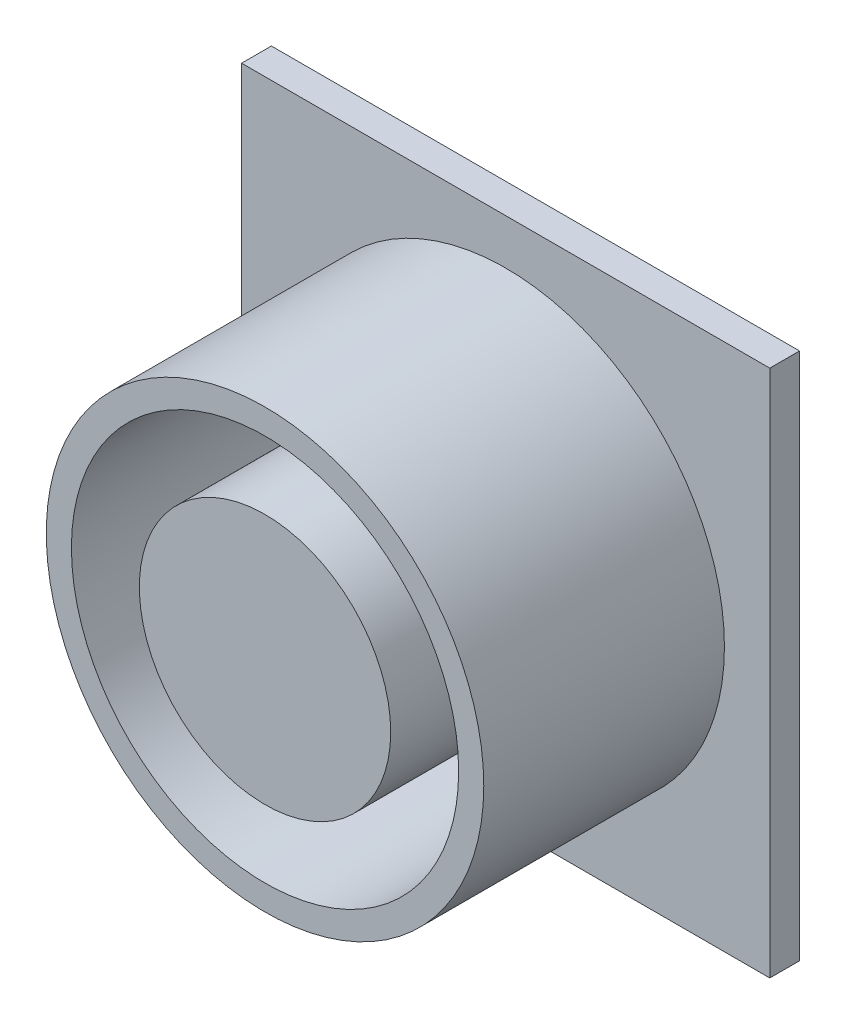
ISO-10303-21;
HEADER;
FILE_DESCRIPTION(('STEP AP214'),'2;1');
FILE_NAME('part.step','',(''),(''),'','','');
FILE_SCHEMA(('AUTOMOTIVE_DESIGN { 1 0 10303 214 1 1 1 1 }'));
ENDSEC;
DATA;
#1=APPLICATION_CONTEXT('core data for automotive mechanical design processes');
#2=APPLICATION_PROTOCOL_DEFINITION('international standard','automotive_design',2000,#1);
#3=PRODUCT_CONTEXT('',#1,'mechanical');
#4=PRODUCT('Part','Part','',(#3));
#5=PRODUCT_RELATED_PRODUCT_CATEGORY('part','',(#4));
#6=PRODUCT_DEFINITION_FORMATION('','',#4);
#7=PRODUCT_DEFINITION_CONTEXT('part definition',#1,'design');
#8=PRODUCT_DEFINITION('design','',#6,#7);
#9=PRODUCT_DEFINITION_SHAPE('','',#8);
#10=(LENGTH_UNIT() NAMED_UNIT(*) SI_UNIT(.MILLI.,.METRE.));
#11=(NAMED_UNIT(*) PLANE_ANGLE_UNIT() SI_UNIT($,.RADIAN.));
#12=(NAMED_UNIT(*) SI_UNIT($,.STERADIAN.) SOLID_ANGLE_UNIT());
#13=UNCERTAINTY_MEASURE_WITH_UNIT(LENGTH_MEASURE(1.E-05),#10,'distance_accuracy_value','');
#14=(GEOMETRIC_REPRESENTATION_CONTEXT(3) GLOBAL_UNCERTAINTY_ASSIGNED_CONTEXT((#13)) GLOBAL_UNIT_ASSIGNED_CONTEXT((#10,
#11,#12)) REPRESENTATION_CONTEXT('',''));
#15=CARTESIAN_POINT('',(0.,0.,0.));
#16=DIRECTION('',(0.,0.,1.));
#17=DIRECTION('',(1.,0.,0.));
#18=AXIS2_PLACEMENT_3D('',#15,#16,#17);
#19=CARTESIAN_POINT('',(-35.14598,-35.14598,3.9624));
#20=DIRECTION('',(0.,1.,0.));
#21=DIRECTION('',(0.,0.,1.));
#22=AXIS2_PLACEMENT_3D('',#19,#20,#21);
#23=PLANE('',#22);
#24=DIRECTION('',(1.,0.,0.));
#25=VECTOR('',#24,1.);
#26=CARTESIAN_POINT('',(-35.14598,-35.14598,0.));
#27=LINE('',#26,#25);
#28=CARTESIAN_POINT('',(-35.14598,-35.14598,0.));
#29=VERTEX_POINT('',#28);
#30=CARTESIAN_POINT('',(35.14598,-35.14598,0.));
#31=VERTEX_POINT('',#30);
#32=EDGE_CURVE('E122',#29,#31,#27,.T.);
#33=ORIENTED_EDGE('',*,*,#32,.T.);
#34=DIRECTION('',(0.,0.,-1.));
#35=VECTOR('',#34,1.);
#36=CARTESIAN_POINT('',(35.14598,-35.14598,3.9624));
#37=LINE('',#36,#35);
#38=CARTESIAN_POINT('',(35.14598,-35.14598,3.9624));
#39=VERTEX_POINT('',#38);
#40=EDGE_CURVE('E60',#39,#31,#37,.T.);
#41=ORIENTED_EDGE('',*,*,#40,.F.);
#42=DIRECTION('',(1.,0.,0.));
#43=VECTOR('',#42,1.);
#44=CARTESIAN_POINT('',(-35.14598,-35.14598,3.9624));
#45=LINE('',#44,#43);
#46=CARTESIAN_POINT('',(-35.14598,-35.14598,3.9624));
#47=VERTEX_POINT('',#46);
#48=EDGE_CURVE('E102',#47,#39,#45,.T.);
#49=ORIENTED_EDGE('',*,*,#48,.F.);
#50=DIRECTION('',(0.,0.,-1.));
#51=VECTOR('',#50,1.);
#52=CARTESIAN_POINT('',(-35.14598,-35.14598,3.9624));
#53=LINE('',#52,#51);
#54=EDGE_CURVE('E68',#47,#29,#53,.T.);
#55=ORIENTED_EDGE('',*,*,#54,.T.);
#56=EDGE_LOOP('',(#33,#41,#49,#55));
#57=FACE_BOUND('',#56,.T.);
#58=ADVANCED_FACE('F51',(#57),#23,.F.);
#59=CARTESIAN_POINT('',(35.14598,-35.14598,3.9624));
#60=DIRECTION('',(-1.,0.,0.));
#61=DIRECTION('',(0.,0.,1.));
#62=AXIS2_PLACEMENT_3D('',#59,#60,#61);
#63=PLANE('',#62);
#64=DIRECTION('',(0.,1.,0.));
#65=VECTOR('',#64,1.);
#66=CARTESIAN_POINT('',(35.14598,-35.14598,0.));
#67=LINE('',#66,#65);
#68=CARTESIAN_POINT('',(35.14598,35.14598,0.));
#69=VERTEX_POINT('',#68);
#70=EDGE_CURVE('E109',#31,#69,#67,.T.);
#71=ORIENTED_EDGE('',*,*,#70,.T.);
#72=DIRECTION('',(0.,0.,-1.));
#73=VECTOR('',#72,1.);
#74=CARTESIAN_POINT('',(35.14598,35.14598,3.9624));
#75=LINE('',#74,#73);
#76=CARTESIAN_POINT('',(35.14598,35.14598,3.9624));
#77=VERTEX_POINT('',#76);
#78=EDGE_CURVE('E107',#77,#69,#75,.T.);
#79=ORIENTED_EDGE('',*,*,#78,.F.);
#80=DIRECTION('',(0.,1.,0.));
#81=VECTOR('',#80,1.);
#82=CARTESIAN_POINT('',(35.14598,-35.14598,3.9624));
#83=LINE('',#82,#81);
#84=EDGE_CURVE('E94',#39,#77,#83,.T.);
#85=ORIENTED_EDGE('',*,*,#84,.F.);
#86=ORIENTED_EDGE('',*,*,#40,.T.);
#87=EDGE_LOOP('',(#71,#79,#85,#86));
#88=FACE_BOUND('',#87,.T.);
#89=ADVANCED_FACE('F108',(#88),#63,.F.);
#90=CARTESIAN_POINT('',(-35.14598,35.14598,3.9624));
#91=DIRECTION('',(0.,1.,0.));
#92=DIRECTION('',(0.,0.,1.));
#93=AXIS2_PLACEMENT_3D('',#90,#91,#92);
#94=PLANE('',#93);
#95=DIRECTION('',(1.,0.,0.));
#96=VECTOR('',#95,1.);
#97=CARTESIAN_POINT('',(-35.14598,35.14598,0.));
#98=LINE('',#97,#96);
#99=CARTESIAN_POINT('',(-35.14598,35.14598,0.));
#100=VERTEX_POINT('',#99);
#101=EDGE_CURVE('E128',#100,#69,#98,.T.);
#102=ORIENTED_EDGE('',*,*,#101,.F.);
#103=DIRECTION('',(0.,0.,-1.));
#104=VECTOR('',#103,1.);
#105=CARTESIAN_POINT('',(-35.14598,35.14598,3.9624));
#106=LINE('',#105,#104);
#107=CARTESIAN_POINT('',(-35.14598,35.14598,3.9624));
#108=VERTEX_POINT('',#107);
#109=EDGE_CURVE('E82',#108,#100,#106,.T.);
#110=ORIENTED_EDGE('',*,*,#109,.F.);
#111=DIRECTION('',(1.,0.,0.));
#112=VECTOR('',#111,1.);
#113=CARTESIAN_POINT('',(-35.14598,35.14598,3.9624));
#114=LINE('',#113,#112);
#115=EDGE_CURVE('E101',#108,#77,#114,.T.);
#116=ORIENTED_EDGE('',*,*,#115,.T.);
#117=ORIENTED_EDGE('',*,*,#78,.T.);
#118=EDGE_LOOP('',(#102,#110,#116,#117));
#119=FACE_BOUND('',#118,.T.);
#120=ADVANCED_FACE('F114',(#119),#94,.T.);
#121=CARTESIAN_POINT('',(-35.14598,-35.14598,3.9624));
#122=DIRECTION('',(-1.,0.,0.));
#123=DIRECTION('',(0.,0.,1.));
#124=AXIS2_PLACEMENT_3D('',#121,#122,#123);
#125=PLANE('',#124);
#126=DIRECTION('',(0.,1.,0.));
#127=VECTOR('',#126,1.);
#128=CARTESIAN_POINT('',(-35.14598,-35.14598,0.));
#129=LINE('',#128,#127);
#130=EDGE_CURVE('E131',#29,#100,#129,.T.);
#131=ORIENTED_EDGE('',*,*,#130,.F.);
#132=ORIENTED_EDGE('',*,*,#54,.F.);
#133=DIRECTION('',(0.,1.,0.));
#134=VECTOR('',#133,1.);
#135=CARTESIAN_POINT('',(-35.14598,-35.14598,3.9624));
#136=LINE('',#135,#134);
#137=EDGE_CURVE('E116',#47,#108,#136,.T.);
#138=ORIENTED_EDGE('',*,*,#137,.T.);
#139=ORIENTED_EDGE('',*,*,#109,.T.);
#140=EDGE_LOOP('',(#131,#132,#138,#139));
#141=FACE_BOUND('',#140,.T.);
#142=ADVANCED_FACE('F141',(#141),#125,.T.);
#143=CARTESIAN_POINT('',(0.,0.,3.9624));
#144=DIRECTION('',(0.,0.,1.));
#145=DIRECTION('',(1.,0.,0.));
#146=AXIS2_PLACEMENT_3D('',#143,#144,#145);
#147=PLANE('',#146);
#148=CARTESIAN_POINT('',(0.,0.,3.9624));
#149=DIRECTION('',(0.,0.,1.));
#150=DIRECTION('',(1.,0.,0.));
#151=AXIS2_PLACEMENT_3D('',#148,#149,#150);
#152=CIRCLE('',#151,29.1113264519275);
#153=CARTESIAN_POINT('',(29.1113264519275,0.,3.9624));
#154=VERTEX_POINT('',#153);
#155=EDGE_CURVE('E252',#154,#154,#152,.T.);
#156=ORIENTED_EDGE('',*,*,#155,.F.);
#157=EDGE_LOOP('',(#156));
#158=FACE_BOUND('',#157,.T.);
#159=ORIENTED_EDGE('',*,*,#48,.T.);
#160=ORIENTED_EDGE('',*,*,#84,.T.);
#161=ORIENTED_EDGE('',*,*,#115,.F.);
#162=ORIENTED_EDGE('',*,*,#137,.F.);
#163=EDGE_LOOP('',(#159,#160,#161,#162));
#164=FACE_BOUND('',#163,.T.);
#165=ADVANCED_FACE('F98',(#158,#164),#147,.T.);
#166=CARTESIAN_POINT('',(0.,0.,0.));
#167=DIRECTION('',(0.,0.,1.));
#168=DIRECTION('',(1.,0.,0.));
#169=AXIS2_PLACEMENT_3D('',#166,#167,#168);
#170=PLANE('',#169);
#171=ORIENTED_EDGE('',*,*,#32,.F.);
#172=ORIENTED_EDGE('',*,*,#130,.T.);
#173=ORIENTED_EDGE('',*,*,#101,.T.);
#174=ORIENTED_EDGE('',*,*,#70,.F.);
#175=EDGE_LOOP('',(#171,#172,#173,#174));
#176=FACE_BOUND('',#175,.T.);
#177=ADVANCED_FACE('F140',(#176),#170,.F.);
#178=CARTESIAN_POINT('',(0.,0.,35.9918));
#179=DIRECTION('',(0.,0.,1.));
#180=DIRECTION('',(1.,0.,0.));
#181=AXIS2_PLACEMENT_3D('',#178,#179,#180);
#182=PLANE('',#181);
#183=CARTESIAN_POINT('',(0.,0.,35.9918));
#184=DIRECTION('',(0.,0.,1.));
#185=DIRECTION('',(1.,0.,0.));
#186=AXIS2_PLACEMENT_3D('',#183,#184,#185);
#187=CIRCLE('',#186,29.1113264519275);
#188=CARTESIAN_POINT('',(29.1113264519275,0.,35.9918));
#189=VERTEX_POINT('',#188);
#190=EDGE_CURVE('E125',#189,#189,#187,.T.);
#191=ORIENTED_EDGE('',*,*,#190,.T.);
#192=EDGE_LOOP('',(#191));
#193=FACE_BOUND('',#192,.T.);
#194=CARTESIAN_POINT('',(0.,0.,35.9918));
#195=DIRECTION('',(0.,0.,1.));
#196=DIRECTION('',(1.,0.,0.));
#197=AXIS2_PLACEMENT_3D('',#194,#195,#196);
#198=CIRCLE('',#197,25.7683);
#199=CARTESIAN_POINT('',(25.7683,0.,35.9918));
#200=VERTEX_POINT('',#199);
#201=EDGE_CURVE('E246',#200,#200,#198,.T.);
#202=ORIENTED_EDGE('',*,*,#201,.F.);
#203=EDGE_LOOP('',(#202));
#204=FACE_BOUND('',#203,.T.);
#205=ADVANCED_FACE('F185',(#193,#204),#182,.T.);
#206=CARTESIAN_POINT('',(0.,0.,35.9918));
#207=DIRECTION('',(0.,0.,-1.));
#208=DIRECTION('',(-1.,0.,0.));
#209=AXIS2_PLACEMENT_3D('',#206,#207,#208);
#210=CYLINDRICAL_SURFACE('',#209,29.1113264519275);
#211=ORIENTED_EDGE('',*,*,#190,.F.);
#212=EDGE_LOOP('',(#211));
#213=FACE_BOUND('',#212,.T.);
#214=ORIENTED_EDGE('',*,*,#155,.T.);
#215=EDGE_LOOP('',(#214));
#216=FACE_BOUND('',#215,.T.);
#217=ADVANCED_FACE('F201',(#213,#216),#210,.T.);
#218=CARTESIAN_POINT('',(0.,0.,35.9918));
#219=DIRECTION('',(0.,0.,-1.));
#220=DIRECTION('',(-1.,0.,0.));
#221=AXIS2_PLACEMENT_3D('',#218,#219,#220);
#222=CYLINDRICAL_SURFACE('',#221,25.7683);
#223=ORIENTED_EDGE('',*,*,#201,.T.);
#224=EDGE_LOOP('',(#223));
#225=FACE_BOUND('',#224,.T.);
#226=CARTESIAN_POINT('',(0.,0.,3.9624));
#227=DIRECTION('',(0.,0.,1.));
#228=DIRECTION('',(1.,0.,0.));
#229=AXIS2_PLACEMENT_3D('',#226,#227,#228);
#230=CIRCLE('',#229,25.7683);
#231=CARTESIAN_POINT('',(25.7683,0.,3.9624));
#232=VERTEX_POINT('',#231);
#233=EDGE_CURVE('E12',#232,#232,#230,.F.);
#234=ORIENTED_EDGE('',*,*,#233,.T.);
#235=EDGE_LOOP('',(#234));
#236=FACE_BOUND('',#235,.T.);
#237=ADVANCED_FACE('F194',(#225,#236),#222,.F.);
#238=CARTESIAN_POINT('',(0.,0.,3.9624));
#239=DIRECTION('',(0.,0.,1.));
#240=DIRECTION('',(1.,0.,0.));
#241=AXIS2_PLACEMENT_3D('',#238,#239,#240);
#242=CIRCLE('',#241,16.7259);
#243=CARTESIAN_POINT('',(16.7259,0.,3.9624));
#244=VERTEX_POINT('',#243);
#245=EDGE_CURVE('E247',#244,#244,#242,.T.);
#246=ORIENTED_EDGE('',*,*,#245,.F.);
#247=EDGE_LOOP('',(#246));
#248=FACE_BOUND('',#247,.T.);
#249=ORIENTED_EDGE('',*,*,#233,.F.);
#250=EDGE_LOOP('',(#249));
#251=FACE_BOUND('',#250,.T.);
#252=ADVANCED_FACE('F151',(#248,#251),#147,.T.);
#253=CARTESIAN_POINT('',(0.,0.,35.9918));
#254=DIRECTION('',(0.,0.,-1.));
#255=DIRECTION('',(-1.,0.,0.));
#256=AXIS2_PLACEMENT_3D('',#253,#254,#255);
#257=CYLINDRICAL_SURFACE('',#256,16.7259);
#258=CARTESIAN_POINT('',(0.,0.,35.9918));
#259=DIRECTION('',(0.,0.,1.));
#260=DIRECTION('',(1.,0.,0.));
#261=AXIS2_PLACEMENT_3D('',#258,#259,#260);
#262=CIRCLE('',#261,16.7259);
#263=CARTESIAN_POINT('',(16.7259,0.,35.9918));
#264=VERTEX_POINT('',#263);
#265=EDGE_CURVE('E244',#264,#264,#262,.T.);
#266=ORIENTED_EDGE('',*,*,#265,.F.);
#267=EDGE_LOOP('',(#266));
#268=FACE_BOUND('',#267,.T.);
#269=ORIENTED_EDGE('',*,*,#245,.T.);
#270=EDGE_LOOP('',(#269));
#271=FACE_BOUND('',#270,.T.);
#272=ADVANCED_FACE('F193',(#268,#271),#257,.T.);
#273=CARTESIAN_POINT('',(0.,0.,35.9918));
#274=DIRECTION('',(0.,0.,1.));
#275=DIRECTION('',(1.,0.,0.));
#276=AXIS2_PLACEMENT_3D('',#273,#274,#275);
#277=PLANE('',#276);
#278=ORIENTED_EDGE('',*,*,#265,.T.);
#279=EDGE_LOOP('',(#278));
#280=FACE_BOUND('',#279,.T.);
#281=ADVANCED_FACE('F229',(#280),#277,.T.);
#282=CLOSED_SHELL('',(#58,#89,#120,#142,#165,#177,#205,#217,#237,#252,#272,#281));
#283=MANIFOLD_SOLID_BREP('B2',#282);
#284=ADVANCED_BREP_SHAPE_REPRESENTATION('',(#18,#283),#14);
#285=SHAPE_DEFINITION_REPRESENTATION(#9,#284);
ENDSEC;
END-ISO-10303-21;
